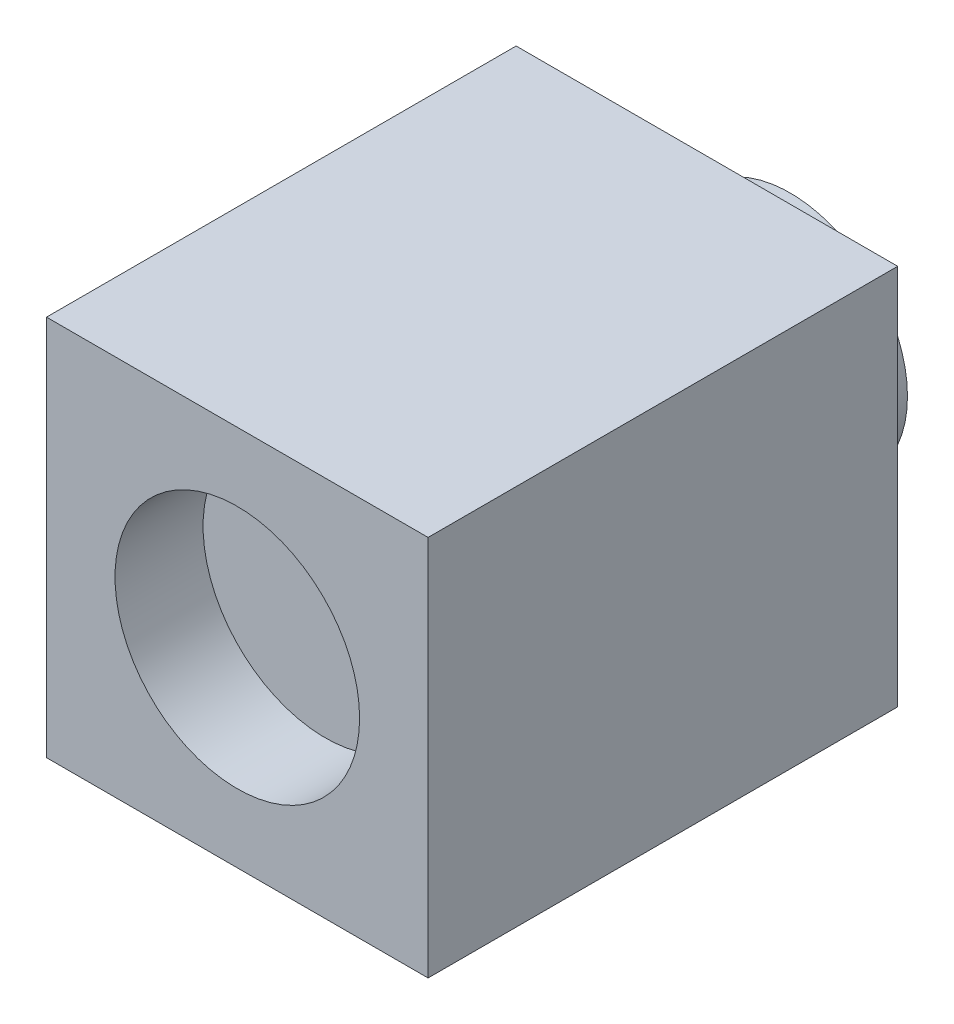
ISO-10303-21;
HEADER;
FILE_DESCRIPTION(('STEP AP214'),'2;1');
FILE_NAME('part.step','',(''),(''),'','','');
FILE_SCHEMA(('AUTOMOTIVE_DESIGN { 1 0 10303 214 1 1 1 1 }'));
ENDSEC;
DATA;
#1=APPLICATION_CONTEXT('core data for automotive mechanical design processes');
#2=APPLICATION_PROTOCOL_DEFINITION('international standard','automotive_design',2000,#1);
#3=PRODUCT_CONTEXT('',#1,'mechanical');
#4=PRODUCT('Part','Part','',(#3));
#5=PRODUCT_RELATED_PRODUCT_CATEGORY('part','',(#4));
#6=PRODUCT_DEFINITION_FORMATION('','',#4);
#7=PRODUCT_DEFINITION_CONTEXT('part definition',#1,'design');
#8=PRODUCT_DEFINITION('design','',#6,#7);
#9=PRODUCT_DEFINITION_SHAPE('','',#8);
#10=(LENGTH_UNIT() NAMED_UNIT(*) SI_UNIT(.MILLI.,.METRE.));
#11=(NAMED_UNIT(*) PLANE_ANGLE_UNIT() SI_UNIT($,.RADIAN.));
#12=(NAMED_UNIT(*) SI_UNIT($,.STERADIAN.) SOLID_ANGLE_UNIT());
#13=UNCERTAINTY_MEASURE_WITH_UNIT(LENGTH_MEASURE(1.E-05),#10,'distance_accuracy_value','');
#14=(GEOMETRIC_REPRESENTATION_CONTEXT(3) GLOBAL_UNCERTAINTY_ASSIGNED_CONTEXT((#13)) GLOBAL_UNIT_ASSIGNED_CONTEXT((#10,
#11,#12)) REPRESENTATION_CONTEXT('',''));
#15=CARTESIAN_POINT('',(0.,0.,0.));
#16=DIRECTION('',(0.,0.,1.));
#17=DIRECTION('',(1.,0.,0.));
#18=AXIS2_PLACEMENT_3D('',#15,#16,#17);
#19=CARTESIAN_POINT('',(0.,0.,0.));
#20=DIRECTION('',(0.,0.,-1.));
#21=DIRECTION('',(-1.,0.,0.));
#22=AXIS2_PLACEMENT_3D('',#19,#20,#21);
#23=PLANE('',#22);
#24=DIRECTION('',(0.,1.,0.));
#25=VECTOR('',#24,1.);
#26=CARTESIAN_POINT('',(3.9,-3.9,0.));
#27=LINE('',#26,#25);
#28=CARTESIAN_POINT('',(3.9,-3.9,0.));
#29=VERTEX_POINT('',#28);
#30=CARTESIAN_POINT('',(3.9,3.9,0.));
#31=VERTEX_POINT('',#30);
#32=EDGE_CURVE('E99',#29,#31,#27,.T.);
#33=ORIENTED_EDGE('',*,*,#32,.F.);
#34=DIRECTION('',(1.,0.,0.));
#35=VECTOR('',#34,1.);
#36=CARTESIAN_POINT('',(-3.9,-3.9,0.));
#37=LINE('',#36,#35);
#38=CARTESIAN_POINT('',(-3.9,-3.9,0.));
#39=VERTEX_POINT('',#38);
#40=EDGE_CURVE('E75',#39,#29,#37,.T.);
#41=ORIENTED_EDGE('',*,*,#40,.F.);
#42=DIRECTION('',(0.,-1.,0.));
#43=VECTOR('',#42,1.);
#44=CARTESIAN_POINT('',(-3.9,-3.9,0.));
#45=LINE('',#44,#43);
#46=CARTESIAN_POINT('',(-3.9,3.9,0.));
#47=VERTEX_POINT('',#46);
#48=EDGE_CURVE('E69',#47,#39,#45,.T.);
#49=ORIENTED_EDGE('',*,*,#48,.F.);
#50=DIRECTION('',(-1.,0.,0.));
#51=VECTOR('',#50,1.);
#52=CARTESIAN_POINT('',(-3.9,3.9,0.));
#53=LINE('',#52,#51);
#54=EDGE_CURVE('E91',#31,#47,#53,.T.);
#55=ORIENTED_EDGE('',*,*,#54,.F.);
#56=EDGE_LOOP('',(#33,#41,#49,#55));
#57=FACE_BOUND('',#56,.T.);
#58=CARTESIAN_POINT('',(0.,0.,0.));
#59=DIRECTION('',(0.,0.,-1.));
#60=DIRECTION('',(-1.,0.,0.));
#61=AXIS2_PLACEMENT_3D('',#58,#59,#60);
#62=CIRCLE('',#61,2.4);
#63=CARTESIAN_POINT('',(-2.4,0.,0.));
#64=VERTEX_POINT('',#63);
#65=EDGE_CURVE('E113',#64,#64,#62,.T.);
#66=ORIENTED_EDGE('',*,*,#65,.F.);
#67=EDGE_LOOP('',(#66));
#68=FACE_BOUND('',#67,.T.);
#69=ADVANCED_FACE('F35',(#57,#68),#23,.T.);
#70=CARTESIAN_POINT('',(3.9,-3.9,9.6));
#71=DIRECTION('',(-1.,0.,0.));
#72=DIRECTION('',(0.,0.,1.));
#73=AXIS2_PLACEMENT_3D('',#70,#71,#72);
#74=PLANE('',#73);
#75=ORIENTED_EDGE('',*,*,#32,.T.);
#76=DIRECTION('',(0.,0.,-1.));
#77=VECTOR('',#76,1.);
#78=CARTESIAN_POINT('',(3.9,3.9,9.6));
#79=LINE('',#78,#77);
#80=CARTESIAN_POINT('',(3.9,3.9,9.6));
#81=VERTEX_POINT('',#80);
#82=EDGE_CURVE('E11',#81,#31,#79,.T.);
#83=ORIENTED_EDGE('',*,*,#82,.F.);
#84=DIRECTION('',(0.,1.,0.));
#85=VECTOR('',#84,1.);
#86=CARTESIAN_POINT('',(3.9,-3.9,9.6));
#87=LINE('',#86,#85);
#88=CARTESIAN_POINT('',(3.9,-3.9,9.6));
#89=VERTEX_POINT('',#88);
#90=EDGE_CURVE('E87',#89,#81,#87,.T.);
#91=ORIENTED_EDGE('',*,*,#90,.F.);
#92=DIRECTION('',(0.,0.,-1.));
#93=VECTOR('',#92,1.);
#94=CARTESIAN_POINT('',(3.9,-3.9,9.6));
#95=LINE('',#94,#93);
#96=EDGE_CURVE('E95',#89,#29,#95,.T.);
#97=ORIENTED_EDGE('',*,*,#96,.T.);
#98=EDGE_LOOP('',(#75,#83,#91,#97));
#99=FACE_BOUND('',#98,.T.);
#100=ADVANCED_FACE('F37',(#99),#74,.F.);
#101=CARTESIAN_POINT('',(-3.9,3.9,9.6));
#102=DIRECTION('',(0.,-1.,0.));
#103=DIRECTION('',(0.,0.,-1.));
#104=AXIS2_PLACEMENT_3D('',#101,#102,#103);
#105=PLANE('',#104);
#106=ORIENTED_EDGE('',*,*,#54,.T.);
#107=DIRECTION('',(0.,0.,-1.));
#108=VECTOR('',#107,1.);
#109=CARTESIAN_POINT('',(-3.9,3.9,9.6));
#110=LINE('',#109,#108);
#111=CARTESIAN_POINT('',(-3.9,3.9,9.6));
#112=VERTEX_POINT('',#111);
#113=EDGE_CURVE('E44',#112,#47,#110,.T.);
#114=ORIENTED_EDGE('',*,*,#113,.F.);
#115=DIRECTION('',(-1.,0.,0.));
#116=VECTOR('',#115,1.);
#117=CARTESIAN_POINT('',(-3.9,3.9,9.6));
#118=LINE('',#117,#116);
#119=EDGE_CURVE('E82',#81,#112,#118,.T.);
#120=ORIENTED_EDGE('',*,*,#119,.F.);
#121=ORIENTED_EDGE('',*,*,#82,.T.);
#122=EDGE_LOOP('',(#106,#114,#120,#121));
#123=FACE_BOUND('',#122,.T.);
#124=ADVANCED_FACE('F90',(#123),#105,.F.);
#125=CARTESIAN_POINT('',(-3.9,-3.9,9.6));
#126=DIRECTION('',(1.,0.,0.));
#127=DIRECTION('',(0.,0.,-1.));
#128=AXIS2_PLACEMENT_3D('',#125,#126,#127);
#129=PLANE('',#128);
#130=ORIENTED_EDGE('',*,*,#48,.T.);
#131=DIRECTION('',(0.,0.,-1.));
#132=VECTOR('',#131,1.);
#133=CARTESIAN_POINT('',(-3.9,-3.9,9.6));
#134=LINE('',#133,#132);
#135=CARTESIAN_POINT('',(-3.9,-3.9,9.6));
#136=VERTEX_POINT('',#135);
#137=EDGE_CURVE('E92',#136,#39,#134,.T.);
#138=ORIENTED_EDGE('',*,*,#137,.F.);
#139=DIRECTION('',(0.,-1.,0.));
#140=VECTOR('',#139,1.);
#141=CARTESIAN_POINT('',(-3.9,-3.9,9.6));
#142=LINE('',#141,#140);
#143=EDGE_CURVE('E85',#112,#136,#142,.T.);
#144=ORIENTED_EDGE('',*,*,#143,.F.);
#145=ORIENTED_EDGE('',*,*,#113,.T.);
#146=EDGE_LOOP('',(#130,#138,#144,#145));
#147=FACE_BOUND('',#146,.T.);
#148=ADVANCED_FACE('F93',(#147),#129,.F.);
#149=CARTESIAN_POINT('',(-3.9,-3.9,9.6));
#150=DIRECTION('',(0.,1.,0.));
#151=DIRECTION('',(0.,0.,1.));
#152=AXIS2_PLACEMENT_3D('',#149,#150,#151);
#153=PLANE('',#152);
#154=ORIENTED_EDGE('',*,*,#40,.T.);
#155=ORIENTED_EDGE('',*,*,#96,.F.);
#156=DIRECTION('',(1.,0.,0.));
#157=VECTOR('',#156,1.);
#158=CARTESIAN_POINT('',(-3.9,-3.9,9.6));
#159=LINE('',#158,#157);
#160=EDGE_CURVE('E52',#136,#89,#159,.T.);
#161=ORIENTED_EDGE('',*,*,#160,.F.);
#162=ORIENTED_EDGE('',*,*,#137,.T.);
#163=EDGE_LOOP('',(#154,#155,#161,#162));
#164=FACE_BOUND('',#163,.T.);
#165=ADVANCED_FACE('F107',(#164),#153,.F.);
#166=CARTESIAN_POINT('',(0.,0.,9.6));
#167=DIRECTION('',(0.,0.,-1.));
#168=DIRECTION('',(-1.,0.,0.));
#169=AXIS2_PLACEMENT_3D('',#166,#167,#168);
#170=PLANE('',#169);
#171=CARTESIAN_POINT('',(0.,0.,9.6));
#172=DIRECTION('',(0.,0.,1.));
#173=DIRECTION('',(1.,0.,0.));
#174=AXIS2_PLACEMENT_3D('',#171,#172,#173);
#175=CIRCLE('',#174,2.5);
#176=CARTESIAN_POINT('',(2.5,0.,9.6));
#177=VERTEX_POINT('',#176);
#178=EDGE_CURVE('E119',#177,#177,#175,.T.);
#179=ORIENTED_EDGE('',*,*,#178,.F.);
#180=EDGE_LOOP('',(#179));
#181=FACE_BOUND('',#180,.T.);
#182=ORIENTED_EDGE('',*,*,#90,.T.);
#183=ORIENTED_EDGE('',*,*,#119,.T.);
#184=ORIENTED_EDGE('',*,*,#143,.T.);
#185=ORIENTED_EDGE('',*,*,#160,.T.);
#186=EDGE_LOOP('',(#182,#183,#184,#185));
#187=FACE_BOUND('',#186,.T.);
#188=ADVANCED_FACE('F83',(#181,#187),#170,.F.);
#189=CARTESIAN_POINT('',(0.,0.,-1.7));
#190=DIRECTION('',(0.,0.,1.));
#191=DIRECTION('',(1.,0.,0.));
#192=AXIS2_PLACEMENT_3D('',#189,#190,#191);
#193=CYLINDRICAL_SURFACE('',#192,2.4);
#194=CARTESIAN_POINT('',(0.,0.,-1.7));
#195=DIRECTION('',(0.,0.,-1.));
#196=DIRECTION('',(-1.,0.,0.));
#197=AXIS2_PLACEMENT_3D('',#194,#195,#196);
#198=CIRCLE('',#197,2.4);
#199=CARTESIAN_POINT('',(-2.4,0.,-1.7));
#200=VERTEX_POINT('',#199);
#201=EDGE_CURVE('E102',#200,#200,#198,.T.);
#202=ORIENTED_EDGE('',*,*,#201,.F.);
#203=EDGE_LOOP('',(#202));
#204=FACE_BOUND('',#203,.T.);
#205=ORIENTED_EDGE('',*,*,#65,.T.);
#206=EDGE_LOOP('',(#205));
#207=FACE_BOUND('',#206,.T.);
#208=ADVANCED_FACE('F135',(#204,#207),#193,.T.);
#209=CARTESIAN_POINT('',(0.,0.,-1.7));
#210=DIRECTION('',(0.,0.,-1.));
#211=DIRECTION('',(-1.,0.,0.));
#212=AXIS2_PLACEMENT_3D('',#209,#210,#211);
#213=PLANE('',#212);
#214=ORIENTED_EDGE('',*,*,#201,.T.);
#215=EDGE_LOOP('',(#214));
#216=FACE_BOUND('',#215,.T.);
#217=ADVANCED_FACE('F130',(#216),#213,.T.);
#218=CARTESIAN_POINT('',(0.,0.,7.8));
#219=DIRECTION('',(0.,0.,1.));
#220=DIRECTION('',(1.,0.,0.));
#221=AXIS2_PLACEMENT_3D('',#218,#219,#220);
#222=CYLINDRICAL_SURFACE('',#221,2.5);
#223=CARTESIAN_POINT('',(0.,0.,7.8));
#224=DIRECTION('',(0.,0.,1.));
#225=DIRECTION('',(1.,0.,0.));
#226=AXIS2_PLACEMENT_3D('',#223,#224,#225);
#227=CIRCLE('',#226,2.5);
#228=CARTESIAN_POINT('',(2.5,0.,7.8));
#229=VERTEX_POINT('',#228);
#230=EDGE_CURVE('E116',#229,#229,#227,.T.);
#231=ORIENTED_EDGE('',*,*,#230,.F.);
#232=EDGE_LOOP('',(#231));
#233=FACE_BOUND('',#232,.T.);
#234=ORIENTED_EDGE('',*,*,#178,.T.);
#235=EDGE_LOOP('',(#234));
#236=FACE_BOUND('',#235,.T.);
#237=ADVANCED_FACE('F127',(#233,#236),#222,.F.);
#238=CARTESIAN_POINT('',(0.,0.,7.8));
#239=DIRECTION('',(0.,0.,1.));
#240=DIRECTION('',(1.,0.,0.));
#241=AXIS2_PLACEMENT_3D('',#238,#239,#240);
#242=PLANE('',#241);
#243=ORIENTED_EDGE('',*,*,#230,.T.);
#244=EDGE_LOOP('',(#243));
#245=FACE_BOUND('',#244,.T.);
#246=ADVANCED_FACE('F125',(#245),#242,.T.);
#247=CLOSED_SHELL('',(#69,#100,#124,#148,#165,#188,#208,#217,#237,#246));
#248=MANIFOLD_SOLID_BREP('B2',#247);
#249=ADVANCED_BREP_SHAPE_REPRESENTATION('',(#18,#248),#14);
#250=SHAPE_DEFINITION_REPRESENTATION(#9,#249);
ENDSEC;
END-ISO-10303-21;
